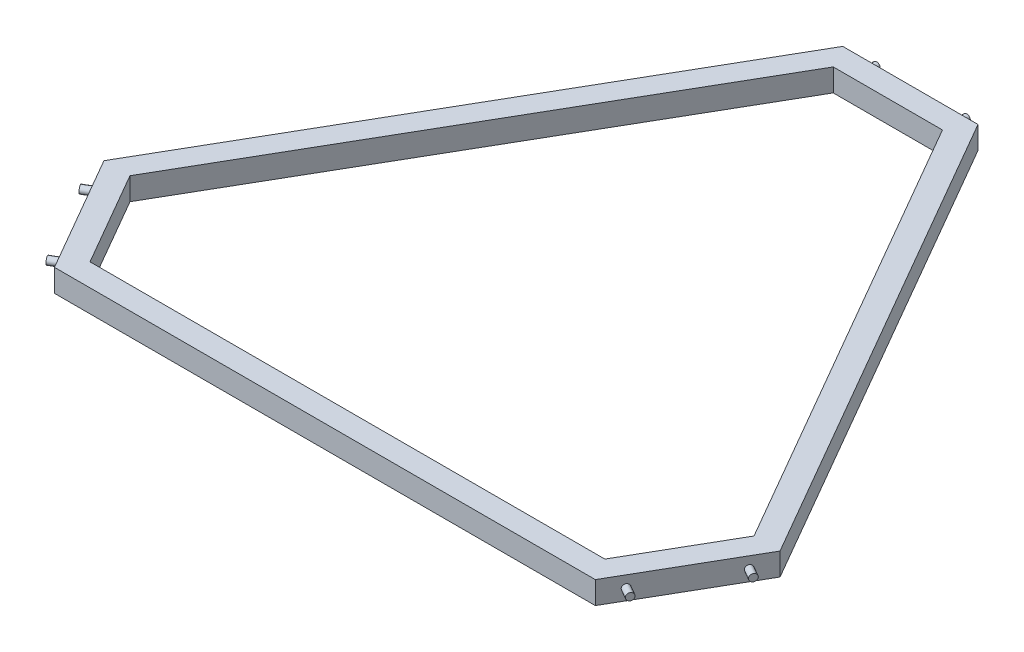
ISO-10303-21;
HEADER;
FILE_DESCRIPTION(('STEP AP214'),'2;1');
FILE_NAME('part.step','',(''),(''),'','','');
FILE_SCHEMA(('AUTOMOTIVE_DESIGN { 1 0 10303 214 1 1 1 1 }'));
ENDSEC;
DATA;
#1=APPLICATION_CONTEXT('core data for automotive mechanical design processes');
#2=APPLICATION_PROTOCOL_DEFINITION('international standard','automotive_design',2000,#1);
#3=PRODUCT_CONTEXT('',#1,'mechanical');
#4=PRODUCT('Part','Part','',(#3));
#5=PRODUCT_RELATED_PRODUCT_CATEGORY('part','',(#4));
#6=PRODUCT_DEFINITION_FORMATION('','',#4);
#7=PRODUCT_DEFINITION_CONTEXT('part definition',#1,'design');
#8=PRODUCT_DEFINITION('design','',#6,#7);
#9=PRODUCT_DEFINITION_SHAPE('','',#8);
#10=(LENGTH_UNIT() NAMED_UNIT(*) SI_UNIT(.MILLI.,.METRE.));
#11=(NAMED_UNIT(*) PLANE_ANGLE_UNIT() SI_UNIT($,.RADIAN.));
#12=(NAMED_UNIT(*) SI_UNIT($,.STERADIAN.) SOLID_ANGLE_UNIT());
#13=UNCERTAINTY_MEASURE_WITH_UNIT(LENGTH_MEASURE(1.E-05),#10,'distance_accuracy_value','');
#14=(GEOMETRIC_REPRESENTATION_CONTEXT(3) GLOBAL_UNCERTAINTY_ASSIGNED_CONTEXT((#13)) GLOBAL_UNIT_ASSIGNED_CONTEXT((#10,
#11,#12)) REPRESENTATION_CONTEXT('',''));
#15=CARTESIAN_POINT('',(0.,0.,0.));
#16=DIRECTION('',(0.,0.,1.));
#17=DIRECTION('',(1.,0.,0.));
#18=AXIS2_PLACEMENT_3D('',#15,#16,#17);
#19=CARTESIAN_POINT('',(0.,50.,0.));
#20=DIRECTION('',(0.,1.,0.));
#21=DIRECTION('',(0.,0.,1.));
#22=AXIS2_PLACEMENT_3D('',#19,#20,#21);
#23=PLANE('',#22);
#24=DIRECTION('',(0.499999999999998,0.,0.86602540378444));
#25=VECTOR('',#24,1.);
#26=CARTESIAN_POINT('',(-749.999999999999,50.,259.807621135326));
#27=LINE('',#26,#25);
#28=CARTESIAN_POINT('',(-749.999999999999,50.,259.807621135326));
#29=VERTEX_POINT('',#28);
#30=CARTESIAN_POINT('',(-600.,50.,519.615242270658));
#31=VERTEX_POINT('',#30);
#32=EDGE_CURVE('E175',#29,#31,#27,.T.);
#33=ORIENTED_EDGE('',*,*,#32,.T.);
#34=DIRECTION('',(1.,0.,0.));
#35=VECTOR('',#34,1.);
#36=CARTESIAN_POINT('',(-600.,50.,519.615242270658));
#37=LINE('',#36,#35);
#38=CARTESIAN_POINT('',(600.,50.,519.615242270658));
#39=VERTEX_POINT('',#38);
#40=EDGE_CURVE('E178',#31,#39,#37,.T.);
#41=ORIENTED_EDGE('',*,*,#40,.T.);
#42=DIRECTION('',(0.500000000000016,0.,-0.866025403784429));
#43=VECTOR('',#42,1.);
#44=CARTESIAN_POINT('',(600.,50.,519.615242270658));
#45=LINE('',#44,#43);
#46=CARTESIAN_POINT('',(750.000000000005,50.,259.807621135329));
#47=VERTEX_POINT('',#46);
#48=EDGE_CURVE('E181',#39,#47,#45,.T.);
#49=ORIENTED_EDGE('',*,*,#48,.T.);
#50=DIRECTION('',(-0.499999999999999,0.,-0.866025403784439));
#51=VECTOR('',#50,1.);
#52=CARTESIAN_POINT('',(750.000000000005,50.,259.807621135329));
#53=LINE('',#52,#51);
#54=CARTESIAN_POINT('',(150.000000000006,50.,-779.422863405997));
#55=VERTEX_POINT('',#54);
#56=EDGE_CURVE('E183',#47,#55,#53,.T.);
#57=ORIENTED_EDGE('',*,*,#56,.T.);
#58=DIRECTION('',(-1.,0.,0.));
#59=VECTOR('',#58,1.);
#60=CARTESIAN_POINT('',(150.000000000006,50.,-779.422863405997));
#61=LINE('',#60,#59);
#62=CARTESIAN_POINT('',(-149.999999999994,50.,-779.422863405997));
#63=VERTEX_POINT('',#62);
#64=EDGE_CURVE('E185',#55,#63,#61,.T.);
#65=ORIENTED_EDGE('',*,*,#64,.T.);
#66=DIRECTION('',(-0.500000000000004,0.,0.866025403784436));
#67=VECTOR('',#66,1.);
#68=CARTESIAN_POINT('',(-149.999999999994,50.,-779.422863405997));
#69=LINE('',#68,#67);
#70=EDGE_CURVE('E187',#63,#29,#69,.T.);
#71=ORIENTED_EDGE('',*,*,#70,.T.);
#72=EDGE_LOOP('',(#33,#41,#49,#57,#65,#71));
#73=FACE_BOUND('',#72,.T.);
#74=DIRECTION('',(-0.500000000000004,0.,0.866025403784436));
#75=VECTOR('',#74,1.);
#76=CARTESIAN_POINT('',(-121.132486540513,50.,-729.422863405997));
#77=LINE('',#76,#75);
#78=CARTESIAN_POINT('',(-121.132486540513,50.,-729.422863405997));
#79=VERTEX_POINT('',#78);
#80=CARTESIAN_POINT('',(-692.264973081037,50.,259.807621135326));
#81=VERTEX_POINT('',#80);
#82=EDGE_CURVE('E130',#79,#81,#77,.T.);
#83=ORIENTED_EDGE('',*,*,#82,.F.);
#84=DIRECTION('',(-1.,0.,0.));
#85=VECTOR('',#84,1.);
#86=CARTESIAN_POINT('',(121.132486540525,50.,-729.422863405997));
#87=LINE('',#86,#85);
#88=CARTESIAN_POINT('',(121.132486540525,50.,-729.422863405997));
#89=VERTEX_POINT('',#88);
#90=EDGE_CURVE('E122',#89,#79,#87,.T.);
#91=ORIENTED_EDGE('',*,*,#90,.F.);
#92=DIRECTION('',(-0.499999999999999,0.,-0.866025403784439));
#93=VECTOR('',#92,1.);
#94=CARTESIAN_POINT('',(692.264973081042,50.,259.807621135329));
#95=LINE('',#94,#93);
#96=CARTESIAN_POINT('',(692.264973081042,50.,259.807621135329));
#97=VERTEX_POINT('',#96);
#98=EDGE_CURVE('E152',#97,#89,#95,.T.);
#99=ORIENTED_EDGE('',*,*,#98,.F.);
#100=DIRECTION('',(0.500000000000016,0.,-0.866025403784429));
#101=VECTOR('',#100,1.);
#102=CARTESIAN_POINT('',(571.132486540519,50.,469.615242270658));
#103=LINE('',#102,#101);
#104=CARTESIAN_POINT('',(571.132486540519,50.,469.615242270658));
#105=VERTEX_POINT('',#104);
#106=EDGE_CURVE('E150',#105,#97,#103,.T.);
#107=ORIENTED_EDGE('',*,*,#106,.F.);
#108=DIRECTION('',(1.,0.,0.));
#109=VECTOR('',#108,1.);
#110=CARTESIAN_POINT('',(-571.132486540518,50.,469.615242270658));
#111=LINE('',#110,#109);
#112=CARTESIAN_POINT('',(-571.132486540518,50.,469.615242270658));
#113=VERTEX_POINT('',#112);
#114=EDGE_CURVE('E145',#113,#105,#111,.T.);
#115=ORIENTED_EDGE('',*,*,#114,.F.);
#116=DIRECTION('',(0.499999999999998,0.,0.86602540378444));
#117=VECTOR('',#116,1.);
#118=CARTESIAN_POINT('',(-692.264973081037,50.,259.807621135326));
#119=LINE('',#118,#117);
#120=EDGE_CURVE('E143',#81,#113,#119,.T.);
#121=ORIENTED_EDGE('',*,*,#120,.F.);
#122=EDGE_LOOP('',(#83,#91,#99,#107,#115,#121));
#123=FACE_BOUND('',#122,.T.);
#124=ADVANCED_FACE('F33',(#73,#123),#23,.T.);
#125=CARTESIAN_POINT('',(0.,0.,0.));
#126=DIRECTION('',(0.,1.,0.));
#127=DIRECTION('',(0.,0.,1.));
#128=AXIS2_PLACEMENT_3D('',#125,#126,#127);
#129=PLANE('',#128);
#130=DIRECTION('',(0.499999999999998,0.,0.86602540378444));
#131=VECTOR('',#130,1.);
#132=CARTESIAN_POINT('',(-749.999999999999,0.,259.807621135326));
#133=LINE('',#132,#131);
#134=CARTESIAN_POINT('',(-749.999999999999,0.,259.807621135326));
#135=VERTEX_POINT('',#134);
#136=CARTESIAN_POINT('',(-600.,0.,519.615242270658));
#137=VERTEX_POINT('',#136);
#138=EDGE_CURVE('E138',#135,#137,#133,.T.);
#139=ORIENTED_EDGE('',*,*,#138,.F.);
#140=DIRECTION('',(-0.500000000000004,0.,0.866025403784436));
#141=VECTOR('',#140,1.);
#142=CARTESIAN_POINT('',(-149.999999999994,0.,-779.422863405997));
#143=LINE('',#142,#141);
#144=CARTESIAN_POINT('',(-149.999999999994,0.,-779.422863405997));
#145=VERTEX_POINT('',#144);
#146=EDGE_CURVE('E179',#145,#135,#143,.T.);
#147=ORIENTED_EDGE('',*,*,#146,.F.);
#148=DIRECTION('',(-1.,0.,0.));
#149=VECTOR('',#148,1.);
#150=CARTESIAN_POINT('',(150.000000000006,0.,-779.422863405997));
#151=LINE('',#150,#149);
#152=CARTESIAN_POINT('',(150.000000000006,0.,-779.422863405997));
#153=VERTEX_POINT('',#152);
#154=EDGE_CURVE('E198',#153,#145,#151,.T.);
#155=ORIENTED_EDGE('',*,*,#154,.F.);
#156=DIRECTION('',(-0.499999999999999,0.,-0.866025403784439));
#157=VECTOR('',#156,1.);
#158=CARTESIAN_POINT('',(750.000000000005,0.,259.807621135329));
#159=LINE('',#158,#157);
#160=CARTESIAN_POINT('',(750.000000000005,0.,259.807621135329));
#161=VERTEX_POINT('',#160);
#162=EDGE_CURVE('E196',#161,#153,#159,.T.);
#163=ORIENTED_EDGE('',*,*,#162,.F.);
#164=DIRECTION('',(0.500000000000016,0.,-0.866025403784429));
#165=VECTOR('',#164,1.);
#166=CARTESIAN_POINT('',(600.,0.,519.615242270658));
#167=LINE('',#166,#165);
#168=CARTESIAN_POINT('',(600.,0.,519.615242270658));
#169=VERTEX_POINT('',#168);
#170=EDGE_CURVE('E194',#169,#161,#167,.T.);
#171=ORIENTED_EDGE('',*,*,#170,.F.);
#172=DIRECTION('',(1.,0.,0.));
#173=VECTOR('',#172,1.);
#174=CARTESIAN_POINT('',(-600.,0.,519.615242270658));
#175=LINE('',#174,#173);
#176=EDGE_CURVE('E192',#137,#169,#175,.T.);
#177=ORIENTED_EDGE('',*,*,#176,.F.);
#178=EDGE_LOOP('',(#139,#147,#155,#163,#171,#177));
#179=FACE_BOUND('',#178,.T.);
#180=DIRECTION('',(-1.,0.,0.));
#181=VECTOR('',#180,1.);
#182=CARTESIAN_POINT('',(121.132486540525,0.,-729.422863405997));
#183=LINE('',#182,#181);
#184=CARTESIAN_POINT('',(121.132486540524,0.,-729.422863405997));
#185=VERTEX_POINT('',#184);
#186=CARTESIAN_POINT('',(-121.132486540513,0.,-729.422863405997));
#187=VERTEX_POINT('',#186);
#188=EDGE_CURVE('E56',#185,#187,#183,.T.);
#189=ORIENTED_EDGE('',*,*,#188,.T.);
#190=DIRECTION('',(-0.500000000000004,0.,0.866025403784436));
#191=VECTOR('',#190,1.);
#192=CARTESIAN_POINT('',(-121.132486540513,0.,-729.422863405997));
#193=LINE('',#192,#191);
#194=CARTESIAN_POINT('',(-692.264973081037,0.,259.807621135326));
#195=VERTEX_POINT('',#194);
#196=EDGE_CURVE('E137',#187,#195,#193,.T.);
#197=ORIENTED_EDGE('',*,*,#196,.T.);
#198=DIRECTION('',(0.499999999999998,0.,0.86602540378444));
#199=VECTOR('',#198,1.);
#200=CARTESIAN_POINT('',(-692.264973081037,0.,259.807621135326));
#201=LINE('',#200,#199);
#202=CARTESIAN_POINT('',(-571.132486540518,0.,469.615242270658));
#203=VERTEX_POINT('',#202);
#204=EDGE_CURVE('E157',#195,#203,#201,.T.);
#205=ORIENTED_EDGE('',*,*,#204,.T.);
#206=DIRECTION('',(1.,0.,0.));
#207=VECTOR('',#206,1.);
#208=CARTESIAN_POINT('',(-571.132486540518,0.,469.615242270658));
#209=LINE('',#208,#207);
#210=CARTESIAN_POINT('',(571.132486540519,0.,469.615242270658));
#211=VERTEX_POINT('',#210);
#212=EDGE_CURVE('E160',#203,#211,#209,.T.);
#213=ORIENTED_EDGE('',*,*,#212,.T.);
#214=DIRECTION('',(0.500000000000016,0.,-0.866025403784429));
#215=VECTOR('',#214,1.);
#216=CARTESIAN_POINT('',(571.132486540519,0.,469.615242270658));
#217=LINE('',#216,#215);
#218=CARTESIAN_POINT('',(692.264973081042,0.,259.807621135329));
#219=VERTEX_POINT('',#218);
#220=EDGE_CURVE('E163',#211,#219,#217,.T.);
#221=ORIENTED_EDGE('',*,*,#220,.T.);
#222=DIRECTION('',(-0.499999999999999,0.,-0.866025403784439));
#223=VECTOR('',#222,1.);
#224=CARTESIAN_POINT('',(692.264973081042,0.,259.807621135329));
#225=LINE('',#224,#223);
#226=EDGE_CURVE('E131',#219,#185,#225,.T.);
#227=ORIENTED_EDGE('',*,*,#226,.T.);
#228=EDGE_LOOP('',(#189,#197,#205,#213,#221,#227));
#229=FACE_BOUND('',#228,.T.);
#230=ADVANCED_FACE('F252',(#179,#229),#129,.F.);
#231=CARTESIAN_POINT('',(-749.999999999999,50.,259.807621135326));
#232=DIRECTION('',(0.86602540378444,0.,-0.499999999999998));
#233=DIRECTION('',(-0.499999999999998,0.,-0.86602540378444));
#234=AXIS2_PLACEMENT_3D('',#231,#232,#233);
#235=PLANE('',#234);
#236=CARTESIAN_POINT('',(-625.000000000016,25.,476.313972081408));
#237=DIRECTION('',(0.86602540378444,0.,-0.499999999999998));
#238=DIRECTION('',(-0.499999999999998,0.,-0.86602540378444));
#239=AXIS2_PLACEMENT_3D('',#236,#237,#238);
#240=CIRCLE('',#239,8.00000000000005);
#241=CARTESIAN_POINT('',(-629.000000000016,25.,469.385768851132));
#242=VERTEX_POINT('',#241);
#243=EDGE_CURVE('E227',#242,#242,#240,.F.);
#244=ORIENTED_EDGE('',*,*,#243,.F.);
#245=EDGE_LOOP('',(#244));
#246=FACE_BOUND('',#245,.T.);
#247=CARTESIAN_POINT('',(-724.999999999997,25.,303.108891324552));
#248=DIRECTION('',(0.86602540378444,0.,-0.499999999999998));
#249=DIRECTION('',(-0.499999999999998,0.,-0.86602540378444));
#250=AXIS2_PLACEMENT_3D('',#247,#248,#249);
#251=CIRCLE('',#250,7.99999999999999);
#252=CARTESIAN_POINT('',(-728.999999999997,25.,296.180688094277));
#253=VERTEX_POINT('',#252);
#254=EDGE_CURVE('E224',#253,#253,#251,.F.);
#255=ORIENTED_EDGE('',*,*,#254,.F.);
#256=EDGE_LOOP('',(#255));
#257=FACE_BOUND('',#256,.T.);
#258=ORIENTED_EDGE('',*,*,#138,.T.);
#259=DIRECTION('',(0.,-1.,0.));
#260=VECTOR('',#259,1.);
#261=CARTESIAN_POINT('',(-600.,50.,519.615242270658));
#262=LINE('',#261,#260);
#263=EDGE_CURVE('E215',#31,#137,#262,.T.);
#264=ORIENTED_EDGE('',*,*,#263,.F.);
#265=ORIENTED_EDGE('',*,*,#32,.F.);
#266=DIRECTION('',(0.,-1.,0.));
#267=VECTOR('',#266,1.);
#268=CARTESIAN_POINT('',(-749.999999999999,50.,259.807621135326));
#269=LINE('',#268,#267);
#270=EDGE_CURVE('E189',#29,#135,#269,.T.);
#271=ORIENTED_EDGE('',*,*,#270,.T.);
#272=EDGE_LOOP('',(#258,#264,#265,#271));
#273=FACE_BOUND('',#272,.T.);
#274=ADVANCED_FACE('F35',(#246,#257,#273),#235,.F.);
#275=CARTESIAN_POINT('',(-600.,50.,519.615242270658));
#276=DIRECTION('',(0.,0.,-1.));
#277=DIRECTION('',(-1.,0.,0.));
#278=AXIS2_PLACEMENT_3D('',#275,#276,#277);
#279=PLANE('',#278);
#280=ORIENTED_EDGE('',*,*,#176,.T.);
#281=DIRECTION('',(0.,-1.,0.));
#282=VECTOR('',#281,1.);
#283=CARTESIAN_POINT('',(600.,50.,519.615242270658));
#284=LINE('',#283,#282);
#285=EDGE_CURVE('E212',#39,#169,#284,.T.);
#286=ORIENTED_EDGE('',*,*,#285,.F.);
#287=ORIENTED_EDGE('',*,*,#40,.F.);
#288=ORIENTED_EDGE('',*,*,#263,.T.);
#289=EDGE_LOOP('',(#280,#286,#287,#288));
#290=FACE_BOUND('',#289,.T.);
#291=ADVANCED_FACE('F267',(#290),#279,.F.);
#292=CARTESIAN_POINT('',(600.,50.,519.615242270658));
#293=DIRECTION('',(-0.866025403784429,0.,-0.500000000000016));
#294=DIRECTION('',(-0.500000000000016,0.,0.866025403784429));
#295=AXIS2_PLACEMENT_3D('',#292,#293,#294);
#296=PLANE('',#295);
#297=CARTESIAN_POINT('',(724.999999999985,25.,303.108891324584));
#298=DIRECTION('',(-0.866025403784429,0.,-0.500000000000016));
#299=DIRECTION('',(-0.500000000000016,0.,0.866025403784429));
#300=AXIS2_PLACEMENT_3D('',#297,#298,#299);
#301=CIRCLE('',#300,8.00000000000005);
#302=CARTESIAN_POINT('',(720.999999999985,25.,310.037094554859));
#303=VERTEX_POINT('',#302);
#304=EDGE_CURVE('E221',#303,#303,#301,.F.);
#305=ORIENTED_EDGE('',*,*,#304,.F.);
#306=EDGE_LOOP('',(#305));
#307=FACE_BOUND('',#306,.T.);
#308=CARTESIAN_POINT('',(625.000000000001,25.,476.313972081437));
#309=DIRECTION('',(-0.866025403784429,0.,-0.500000000000016));
#310=DIRECTION('',(-0.500000000000016,0.,0.866025403784429));
#311=AXIS2_PLACEMENT_3D('',#308,#309,#310);
#312=CIRCLE('',#311,7.99999999999999);
#313=CARTESIAN_POINT('',(621.000000000001,25.,483.242175311712));
#314=VERTEX_POINT('',#313);
#315=EDGE_CURVE('E218',#314,#314,#312,.F.);
#316=ORIENTED_EDGE('',*,*,#315,.F.);
#317=EDGE_LOOP('',(#316));
#318=FACE_BOUND('',#317,.T.);
#319=ORIENTED_EDGE('',*,*,#170,.T.);
#320=DIRECTION('',(0.,-1.,0.));
#321=VECTOR('',#320,1.);
#322=CARTESIAN_POINT('',(750.000000000005,50.,259.807621135329));
#323=LINE('',#322,#321);
#324=EDGE_CURVE('E209',#47,#161,#323,.T.);
#325=ORIENTED_EDGE('',*,*,#324,.F.);
#326=ORIENTED_EDGE('',*,*,#48,.F.);
#327=ORIENTED_EDGE('',*,*,#285,.T.);
#328=EDGE_LOOP('',(#319,#325,#326,#327));
#329=FACE_BOUND('',#328,.T.);
#330=ADVANCED_FACE('F265',(#307,#318,#329),#296,.F.);
#331=CARTESIAN_POINT('',(750.000000000005,50.,259.807621135329));
#332=DIRECTION('',(-0.866025403784439,0.,0.499999999999999));
#333=DIRECTION('',(0.499999999999999,0.,0.866025403784439));
#334=AXIS2_PLACEMENT_3D('',#331,#332,#333);
#335=PLANE('',#334);
#336=ORIENTED_EDGE('',*,*,#162,.T.);
#337=DIRECTION('',(0.,-1.,0.));
#338=VECTOR('',#337,1.);
#339=CARTESIAN_POINT('',(150.000000000006,50.,-779.422863405997));
#340=LINE('',#339,#338);
#341=EDGE_CURVE('E206',#55,#153,#340,.T.);
#342=ORIENTED_EDGE('',*,*,#341,.F.);
#343=ORIENTED_EDGE('',*,*,#56,.F.);
#344=ORIENTED_EDGE('',*,*,#324,.T.);
#345=EDGE_LOOP('',(#336,#342,#343,#344));
#346=FACE_BOUND('',#345,.T.);
#347=ADVANCED_FACE('F238',(#346),#335,.F.);
#348=CARTESIAN_POINT('',(150.000000000006,50.,-779.422863405997));
#349=DIRECTION('',(0.,0.,1.));
#350=DIRECTION('',(1.,0.,0.));
#351=AXIS2_PLACEMENT_3D('',#348,#349,#350);
#352=PLANE('',#351);
#353=CARTESIAN_POINT('',(-99.9999999999591,25.,-779.422863405997));
#354=DIRECTION('',(0.,0.,1.));
#355=DIRECTION('',(1.,0.,0.));
#356=AXIS2_PLACEMENT_3D('',#353,#354,#355);
#357=CIRCLE('',#356,8.00000000000005);
#358=CARTESIAN_POINT('',(-91.999999999959,25.,-779.422863405997));
#359=VERTEX_POINT('',#358);
#360=EDGE_CURVE('E11',#359,#359,#357,.F.);
#361=ORIENTED_EDGE('',*,*,#360,.F.);
#362=EDGE_LOOP('',(#361));
#363=FACE_BOUND('',#362,.T.);
#364=CARTESIAN_POINT('',(100.000000000003,25.,-779.422863405997));
#365=DIRECTION('',(0.,0.,1.));
#366=DIRECTION('',(1.,0.,0.));
#367=AXIS2_PLACEMENT_3D('',#364,#365,#366);
#368=CIRCLE('',#367,7.99999999999999);
#369=CARTESIAN_POINT('',(108.000000000003,25.,-779.422863405997));
#370=VERTEX_POINT('',#369);
#371=EDGE_CURVE('E41',#370,#370,#368,.F.);
#372=ORIENTED_EDGE('',*,*,#371,.F.);
#373=EDGE_LOOP('',(#372));
#374=FACE_BOUND('',#373,.T.);
#375=ORIENTED_EDGE('',*,*,#154,.T.);
#376=DIRECTION('',(0.,-1.,0.));
#377=VECTOR('',#376,1.);
#378=CARTESIAN_POINT('',(-149.999999999994,50.,-779.422863405997));
#379=LINE('',#378,#377);
#380=EDGE_CURVE('E203',#63,#145,#379,.T.);
#381=ORIENTED_EDGE('',*,*,#380,.F.);
#382=ORIENTED_EDGE('',*,*,#64,.F.);
#383=ORIENTED_EDGE('',*,*,#341,.T.);
#384=EDGE_LOOP('',(#375,#381,#382,#383));
#385=FACE_BOUND('',#384,.T.);
#386=ADVANCED_FACE('F234',(#363,#374,#385),#352,.F.);
#387=CARTESIAN_POINT('',(-149.999999999994,50.,-779.422863405997));
#388=DIRECTION('',(0.866025403784436,0.,0.500000000000004));
#389=DIRECTION('',(0.500000000000004,0.,-0.866025403784436));
#390=AXIS2_PLACEMENT_3D('',#387,#388,#389);
#391=PLANE('',#390);
#392=ORIENTED_EDGE('',*,*,#146,.T.);
#393=ORIENTED_EDGE('',*,*,#270,.F.);
#394=ORIENTED_EDGE('',*,*,#70,.F.);
#395=ORIENTED_EDGE('',*,*,#380,.T.);
#396=EDGE_LOOP('',(#392,#393,#394,#395));
#397=FACE_BOUND('',#396,.T.);
#398=ADVANCED_FACE('F237',(#397),#391,.F.);
#399=CARTESIAN_POINT('',(121.132486540525,50.,-729.422863405997));
#400=DIRECTION('',(0.,0.,1.));
#401=DIRECTION('',(1.,0.,0.));
#402=AXIS2_PLACEMENT_3D('',#399,#400,#401);
#403=PLANE('',#402);
#404=ORIENTED_EDGE('',*,*,#188,.F.);
#405=DIRECTION('',(0.,-1.,0.));
#406=VECTOR('',#405,1.);
#407=CARTESIAN_POINT('',(121.132486540525,50.,-729.422863405997));
#408=LINE('',#407,#406);
#409=EDGE_CURVE('E126',#89,#185,#408,.T.);
#410=ORIENTED_EDGE('',*,*,#409,.F.);
#411=ORIENTED_EDGE('',*,*,#90,.T.);
#412=DIRECTION('',(0.,-1.,0.));
#413=VECTOR('',#412,1.);
#414=CARTESIAN_POINT('',(-121.132486540513,50.,-729.422863405997));
#415=LINE('',#414,#413);
#416=EDGE_CURVE('E125',#79,#187,#415,.T.);
#417=ORIENTED_EDGE('',*,*,#416,.T.);
#418=EDGE_LOOP('',(#404,#410,#411,#417));
#419=FACE_BOUND('',#418,.T.);
#420=ADVANCED_FACE('F124',(#419),#403,.T.);
#421=CARTESIAN_POINT('',(-121.132486540513,50.,-729.422863405997));
#422=DIRECTION('',(0.866025403784436,0.,0.500000000000004));
#423=DIRECTION('',(0.500000000000004,0.,-0.866025403784436));
#424=AXIS2_PLACEMENT_3D('',#421,#422,#423);
#425=PLANE('',#424);
#426=ORIENTED_EDGE('',*,*,#196,.F.);
#427=ORIENTED_EDGE('',*,*,#416,.F.);
#428=ORIENTED_EDGE('',*,*,#82,.T.);
#429=DIRECTION('',(0.,-1.,0.));
#430=VECTOR('',#429,1.);
#431=CARTESIAN_POINT('',(-692.264973081037,50.,259.807621135326));
#432=LINE('',#431,#430);
#433=EDGE_CURVE('E139',#81,#195,#432,.T.);
#434=ORIENTED_EDGE('',*,*,#433,.T.);
#435=EDGE_LOOP('',(#426,#427,#428,#434));
#436=FACE_BOUND('',#435,.T.);
#437=ADVANCED_FACE('F134',(#436),#425,.T.);
#438=CARTESIAN_POINT('',(-692.264973081037,50.,259.807621135326));
#439=DIRECTION('',(0.86602540378444,0.,-0.499999999999998));
#440=DIRECTION('',(-0.499999999999998,0.,-0.86602540378444));
#441=AXIS2_PLACEMENT_3D('',#438,#439,#440);
#442=PLANE('',#441);
#443=ORIENTED_EDGE('',*,*,#204,.F.);
#444=ORIENTED_EDGE('',*,*,#433,.F.);
#445=ORIENTED_EDGE('',*,*,#120,.T.);
#446=DIRECTION('',(0.,-1.,0.));
#447=VECTOR('',#446,1.);
#448=CARTESIAN_POINT('',(-571.132486540518,50.,469.615242270658));
#449=LINE('',#448,#447);
#450=EDGE_CURVE('E172',#113,#203,#449,.T.);
#451=ORIENTED_EDGE('',*,*,#450,.T.);
#452=EDGE_LOOP('',(#443,#444,#445,#451));
#453=FACE_BOUND('',#452,.T.);
#454=ADVANCED_FACE('F313',(#453),#442,.T.);
#455=CARTESIAN_POINT('',(-571.132486540518,50.,469.615242270658));
#456=DIRECTION('',(0.,0.,-1.));
#457=DIRECTION('',(-1.,0.,0.));
#458=AXIS2_PLACEMENT_3D('',#455,#456,#457);
#459=PLANE('',#458);
#460=ORIENTED_EDGE('',*,*,#212,.F.);
#461=ORIENTED_EDGE('',*,*,#450,.F.);
#462=ORIENTED_EDGE('',*,*,#114,.T.);
#463=DIRECTION('',(0.,-1.,0.));
#464=VECTOR('',#463,1.);
#465=CARTESIAN_POINT('',(571.132486540519,50.,469.615242270658));
#466=LINE('',#465,#464);
#467=EDGE_CURVE('E170',#105,#211,#466,.T.);
#468=ORIENTED_EDGE('',*,*,#467,.T.);
#469=EDGE_LOOP('',(#460,#461,#462,#468));
#470=FACE_BOUND('',#469,.T.);
#471=ADVANCED_FACE('F319',(#470),#459,.T.);
#472=CARTESIAN_POINT('',(571.132486540519,50.,469.615242270658));
#473=DIRECTION('',(-0.866025403784429,0.,-0.500000000000016));
#474=DIRECTION('',(-0.500000000000016,0.,0.866025403784429));
#475=AXIS2_PLACEMENT_3D('',#472,#473,#474);
#476=PLANE('',#475);
#477=ORIENTED_EDGE('',*,*,#220,.F.);
#478=ORIENTED_EDGE('',*,*,#467,.F.);
#479=ORIENTED_EDGE('',*,*,#106,.T.);
#480=DIRECTION('',(0.,-1.,0.));
#481=VECTOR('',#480,1.);
#482=CARTESIAN_POINT('',(692.264973081042,50.,259.807621135329));
#483=LINE('',#482,#481);
#484=EDGE_CURVE('E48',#97,#219,#483,.T.);
#485=ORIENTED_EDGE('',*,*,#484,.T.);
#486=EDGE_LOOP('',(#477,#478,#479,#485));
#487=FACE_BOUND('',#486,.T.);
#488=ADVANCED_FACE('F327',(#487),#476,.T.);
#489=CARTESIAN_POINT('',(692.264973081042,50.,259.807621135329));
#490=DIRECTION('',(-0.866025403784439,0.,0.499999999999999));
#491=DIRECTION('',(0.499999999999999,0.,0.866025403784439));
#492=AXIS2_PLACEMENT_3D('',#489,#490,#491);
#493=PLANE('',#492);
#494=ORIENTED_EDGE('',*,*,#226,.F.);
#495=ORIENTED_EDGE('',*,*,#484,.F.);
#496=ORIENTED_EDGE('',*,*,#98,.T.);
#497=ORIENTED_EDGE('',*,*,#409,.T.);
#498=EDGE_LOOP('',(#494,#495,#496,#497));
#499=FACE_BOUND('',#498,.T.);
#500=ADVANCED_FACE('F335',(#499),#493,.T.);
#501=CARTESIAN_POINT('',(646.650635094612,25.,488.813972081437));
#502=DIRECTION('',(-0.866025403784429,0.,-0.500000000000017));
#503=DIRECTION('',(-0.500000000000017,0.,0.866025403784429));
#504=AXIS2_PLACEMENT_3D('',#501,#502,#503);
#505=CYLINDRICAL_SURFACE('',#504,7.99999999999999);
#506=CARTESIAN_POINT('',(646.650635094612,25.,488.813972081437));
#507=DIRECTION('',(0.866025403784429,0.,0.500000000000017));
#508=DIRECTION('',(0.500000000000017,0.,-0.866025403784429));
#509=AXIS2_PLACEMENT_3D('',#506,#507,#508);
#510=CIRCLE('',#509,7.99999999999999);
#511=CARTESIAN_POINT('',(650.650635094612,25.,481.885768851162));
#512=VERTEX_POINT('',#511);
#513=EDGE_CURVE('E155',#512,#512,#510,.T.);
#514=ORIENTED_EDGE('',*,*,#513,.F.);
#515=EDGE_LOOP('',(#514));
#516=FACE_BOUND('',#515,.T.);
#517=ORIENTED_EDGE('',*,*,#315,.T.);
#518=EDGE_LOOP('',(#517));
#519=FACE_BOUND('',#518,.T.);
#520=ADVANCED_FACE('F343',(#516,#519),#505,.T.);
#521=CARTESIAN_POINT('',(646.650635094612,25.,488.813972081437));
#522=DIRECTION('',(0.866025403784429,0.,0.500000000000017));
#523=DIRECTION('',(0.500000000000017,0.,-0.866025403784429));
#524=AXIS2_PLACEMENT_3D('',#521,#522,#523);
#525=PLANE('',#524);
#526=ORIENTED_EDGE('',*,*,#513,.T.);
#527=EDGE_LOOP('',(#526));
#528=FACE_BOUND('',#527,.T.);
#529=ADVANCED_FACE('F350',(#528),#525,.T.);
#530=CARTESIAN_POINT('',(746.650635094596,25.,315.608891324584));
#531=DIRECTION('',(-0.866025403784429,0.,-0.500000000000017));
#532=DIRECTION('',(-0.500000000000017,0.,0.866025403784429));
#533=AXIS2_PLACEMENT_3D('',#530,#531,#532);
#534=CYLINDRICAL_SURFACE('',#533,8.00000000000005);
#535=CARTESIAN_POINT('',(746.650635094596,25.,315.608891324584));
#536=DIRECTION('',(0.866025403784429,0.,0.500000000000017));
#537=DIRECTION('',(-0.500000000000017,0.,0.866025403784429));
#538=AXIS2_PLACEMENT_3D('',#535,#536,#537);
#539=CIRCLE('',#538,8.00000000000005);
#540=CARTESIAN_POINT('',(742.650635094596,25.,322.53709455486));
#541=VERTEX_POINT('',#540);
#542=EDGE_CURVE('E518',#541,#541,#539,.T.);
#543=ORIENTED_EDGE('',*,*,#542,.F.);
#544=EDGE_LOOP('',(#543));
#545=FACE_BOUND('',#544,.T.);
#546=ORIENTED_EDGE('',*,*,#304,.T.);
#547=EDGE_LOOP('',(#546));
#548=FACE_BOUND('',#547,.T.);
#549=ADVANCED_FACE('F358',(#545,#548),#534,.T.);
#550=CARTESIAN_POINT('',(746.650635094596,25.,315.608891324584));
#551=DIRECTION('',(-0.866025403784429,0.,-0.500000000000017));
#552=DIRECTION('',(-0.500000000000017,0.,0.866025403784429));
#553=AXIS2_PLACEMENT_3D('',#550,#551,#552);
#554=PLANE('',#553);
#555=ORIENTED_EDGE('',*,*,#542,.T.);
#556=EDGE_LOOP('',(#555));
#557=FACE_BOUND('',#556,.T.);
#558=ADVANCED_FACE('F366',(#557),#554,.F.);
#559=CARTESIAN_POINT('',(-746.650635094609,25.,315.608891324553));
#560=DIRECTION('',(0.866025403784451,0.,-0.499999999999979));
#561=DIRECTION('',(-0.499999999999979,0.,-0.866025403784451));
#562=AXIS2_PLACEMENT_3D('',#559,#560,#561);
#563=CYLINDRICAL_SURFACE('',#562,7.99999999999999);
#564=CARTESIAN_POINT('',(-746.650635094609,25.,315.608891324553));
#565=DIRECTION('',(-0.866025403784451,0.,0.499999999999979));
#566=DIRECTION('',(0.499999999999979,0.,0.866025403784451));
#567=AXIS2_PLACEMENT_3D('',#564,#565,#566);
#568=CIRCLE('',#567,7.99999999999999);
#569=CARTESIAN_POINT('',(-742.65063509461,25.,322.537094554828));
#570=VERTEX_POINT('',#569);
#571=EDGE_CURVE('E515',#570,#570,#568,.T.);
#572=ORIENTED_EDGE('',*,*,#571,.F.);
#573=EDGE_LOOP('',(#572));
#574=FACE_BOUND('',#573,.T.);
#575=ORIENTED_EDGE('',*,*,#254,.T.);
#576=EDGE_LOOP('',(#575));
#577=FACE_BOUND('',#576,.T.);
#578=ADVANCED_FACE('F374',(#574,#577),#563,.T.);
#579=CARTESIAN_POINT('',(-746.650635094609,25.,315.608891324553));
#580=DIRECTION('',(-0.866025403784451,0.,0.499999999999979));
#581=DIRECTION('',(0.499999999999979,0.,0.866025403784451));
#582=AXIS2_PLACEMENT_3D('',#579,#580,#581);
#583=PLANE('',#582);
#584=ORIENTED_EDGE('',*,*,#571,.T.);
#585=EDGE_LOOP('',(#584));
#586=FACE_BOUND('',#585,.T.);
#587=ADVANCED_FACE('F381',(#586),#583,.T.);
#588=CARTESIAN_POINT('',(-646.650635094633,25.,488.81397208141));
#589=DIRECTION('',(0.866025403784451,0.,-0.499999999999979));
#590=DIRECTION('',(-0.499999999999979,0.,-0.866025403784451));
#591=AXIS2_PLACEMENT_3D('',#588,#589,#590);
#592=CYLINDRICAL_SURFACE('',#591,8.00000000000005);
#593=CARTESIAN_POINT('',(-646.650635094633,25.,488.81397208141));
#594=DIRECTION('',(-0.866025403784451,0.,0.499999999999979));
#595=DIRECTION('',(-0.499999999999979,0.,-0.866025403784451));
#596=AXIS2_PLACEMENT_3D('',#593,#594,#595);
#597=CIRCLE('',#596,8.00000000000005);
#598=CARTESIAN_POINT('',(-650.650635094633,25.,481.885768851134));
#599=VERTEX_POINT('',#598);
#600=EDGE_CURVE('E510',#599,#599,#597,.T.);
#601=ORIENTED_EDGE('',*,*,#600,.F.);
#602=EDGE_LOOP('',(#601));
#603=FACE_BOUND('',#602,.T.);
#604=ORIENTED_EDGE('',*,*,#243,.T.);
#605=EDGE_LOOP('',(#604));
#606=FACE_BOUND('',#605,.T.);
#607=ADVANCED_FACE('F389',(#603,#606),#592,.T.);
#608=CARTESIAN_POINT('',(-646.650635094633,25.,488.81397208141));
#609=DIRECTION('',(0.866025403784451,0.,-0.499999999999979));
#610=DIRECTION('',(-0.499999999999979,0.,-0.866025403784451));
#611=AXIS2_PLACEMENT_3D('',#608,#609,#610);
#612=PLANE('',#611);
#613=ORIENTED_EDGE('',*,*,#600,.T.);
#614=EDGE_LOOP('',(#613));
#615=FACE_BOUND('',#614,.T.);
#616=ADVANCED_FACE('F397',(#615),#612,.F.);
#617=CARTESIAN_POINT('',(100.000000000004,25.,-804.422863405992));
#618=DIRECTION('',(0.,0.,1.));
#619=DIRECTION('',(1.,0.,0.));
#620=AXIS2_PLACEMENT_3D('',#617,#618,#619);
#621=CYLINDRICAL_SURFACE('',#620,7.99999999999999);
#622=CARTESIAN_POINT('',(100.000000000004,25.,-804.422863405992));
#623=DIRECTION('',(0.,0.,-1.));
#624=DIRECTION('',(-1.,0.,0.));
#625=AXIS2_PLACEMENT_3D('',#622,#623,#624);
#626=CIRCLE('',#625,7.99999999999999);
#627=CARTESIAN_POINT('',(92.0000000000036,25.,-804.422863405993));
#628=VERTEX_POINT('',#627);
#629=EDGE_CURVE('E507',#628,#628,#626,.T.);
#630=ORIENTED_EDGE('',*,*,#629,.F.);
#631=EDGE_LOOP('',(#630));
#632=FACE_BOUND('',#631,.T.);
#633=ORIENTED_EDGE('',*,*,#371,.T.);
#634=EDGE_LOOP('',(#633));
#635=FACE_BOUND('',#634,.T.);
#636=ADVANCED_FACE('F232',(#632,#635),#621,.T.);
#637=CARTESIAN_POINT('',(100.000000000004,25.,-804.422863405992));
#638=DIRECTION('',(0.,0.,-1.));
#639=DIRECTION('',(-1.,0.,0.));
#640=AXIS2_PLACEMENT_3D('',#637,#638,#639);
#641=PLANE('',#640);
#642=ORIENTED_EDGE('',*,*,#629,.T.);
#643=EDGE_LOOP('',(#642));
#644=FACE_BOUND('',#643,.T.);
#645=ADVANCED_FACE('F412',(#644),#641,.T.);
#646=CARTESIAN_POINT('',(-99.9999999999583,25.,-804.422863405998));
#647=DIRECTION('',(0.,0.,1.));
#648=DIRECTION('',(1.,0.,0.));
#649=AXIS2_PLACEMENT_3D('',#646,#647,#648);
#650=CYLINDRICAL_SURFACE('',#649,8.00000000000005);
#651=CARTESIAN_POINT('',(-99.9999999999583,25.,-804.422863405998));
#652=DIRECTION('',(0.,0.,-1.));
#653=DIRECTION('',(1.,0.,0.));
#654=AXIS2_PLACEMENT_3D('',#651,#652,#653);
#655=CIRCLE('',#654,8.00000000000005);
#656=CARTESIAN_POINT('',(-91.9999999999583,25.,-804.422863405998));
#657=VERTEX_POINT('',#656);
#658=EDGE_CURVE('E506',#657,#657,#655,.T.);
#659=ORIENTED_EDGE('',*,*,#658,.F.);
#660=EDGE_LOOP('',(#659));
#661=FACE_BOUND('',#660,.T.);
#662=ORIENTED_EDGE('',*,*,#360,.T.);
#663=EDGE_LOOP('',(#662));
#664=FACE_BOUND('',#663,.T.);
#665=ADVANCED_FACE('F420',(#661,#664),#650,.T.);
#666=CARTESIAN_POINT('',(-99.9999999999583,25.,-804.422863405998));
#667=DIRECTION('',(0.,0.,1.));
#668=DIRECTION('',(1.,0.,0.));
#669=AXIS2_PLACEMENT_3D('',#666,#667,#668);
#670=PLANE('',#669);
#671=ORIENTED_EDGE('',*,*,#658,.T.);
#672=EDGE_LOOP('',(#671));
#673=FACE_BOUND('',#672,.T.);
#674=ADVANCED_FACE('F428',(#673),#670,.F.);
#675=CLOSED_SHELL('',(#124,#230,#274,#291,#330,#347,#386,#398,#420,#437,#454,#471,#488,#500,
#520,#529,#549,#558,#578,#587,#607,#616,#636,#645,#665,#674));
#676=MANIFOLD_SOLID_BREP('B2',#675);
#677=ADVANCED_BREP_SHAPE_REPRESENTATION('',(#18,#676),#14);
#678=SHAPE_DEFINITION_REPRESENTATION(#9,#677);
ENDSEC;
END-ISO-10303-21;
